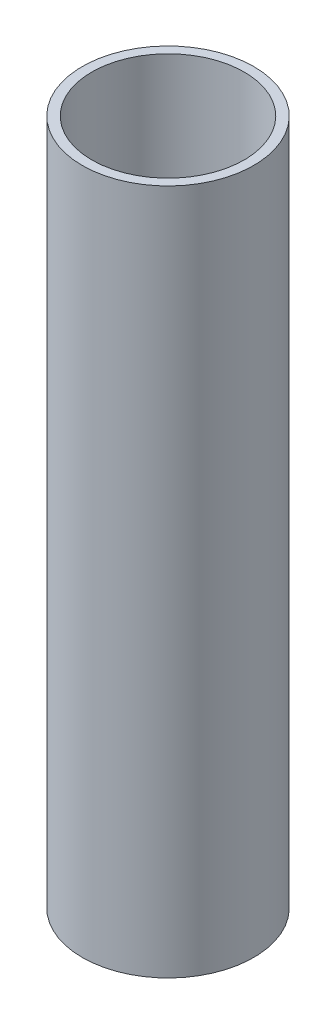
ISO-10303-21;
HEADER;
FILE_DESCRIPTION(('STEP AP214'),'2;1');
FILE_NAME('part.step','',(''),(''),'','','');
FILE_SCHEMA(('AUTOMOTIVE_DESIGN { 1 0 10303 214 1 1 1 1 }'));
ENDSEC;
DATA;
#1=APPLICATION_CONTEXT('core data for automotive mechanical design processes');
#2=APPLICATION_PROTOCOL_DEFINITION('international standard','automotive_design',2000,#1);
#3=PRODUCT_CONTEXT('',#1,'mechanical');
#4=PRODUCT('Part','Part','',(#3));
#5=PRODUCT_RELATED_PRODUCT_CATEGORY('part','',(#4));
#6=PRODUCT_DEFINITION_FORMATION('','',#4);
#7=PRODUCT_DEFINITION_CONTEXT('part definition',#1,'design');
#8=PRODUCT_DEFINITION('design','',#6,#7);
#9=PRODUCT_DEFINITION_SHAPE('','',#8);
#10=(LENGTH_UNIT() NAMED_UNIT(*) SI_UNIT(.MILLI.,.METRE.));
#11=(NAMED_UNIT(*) PLANE_ANGLE_UNIT() SI_UNIT($,.RADIAN.));
#12=(NAMED_UNIT(*) SI_UNIT($,.STERADIAN.) SOLID_ANGLE_UNIT());
#13=UNCERTAINTY_MEASURE_WITH_UNIT(LENGTH_MEASURE(1.E-05),#10,'distance_accuracy_value','');
#14=(GEOMETRIC_REPRESENTATION_CONTEXT(3) GLOBAL_UNCERTAINTY_ASSIGNED_CONTEXT((#13)) GLOBAL_UNIT_ASSIGNED_CONTEXT((#10,
#11,#12)) REPRESENTATION_CONTEXT('',''));
#15=CARTESIAN_POINT('',(0.,0.,0.));
#16=DIRECTION('',(0.,0.,1.));
#17=DIRECTION('',(1.,0.,0.));
#18=AXIS2_PLACEMENT_3D('',#15,#16,#17);
#19=CARTESIAN_POINT('',(0.,228.6,0.));
#20=DIRECTION('',(0.,1.,0.));
#21=DIRECTION('',(0.,0.,1.));
#22=AXIS2_PLACEMENT_3D('',#19,#20,#21);
#23=PLANE('',#22);
#24=CARTESIAN_POINT('',(0.,228.6,0.));
#25=DIRECTION('',(0.,1.,0.));
#26=DIRECTION('',(0.,0.,1.));
#27=AXIS2_PLACEMENT_3D('',#24,#25,#26);
#28=CIRCLE('',#27,57.15);
#29=CARTESIAN_POINT('',(0.,228.6,57.15));
#30=VERTEX_POINT('',#29);
#31=EDGE_CURVE('E10',#30,#30,#28,.T.);
#32=ORIENTED_EDGE('',*,*,#31,.T.);
#33=EDGE_LOOP('',(#32));
#34=FACE_BOUND('',#33,.T.);
#35=CARTESIAN_POINT('',(0.,228.6,0.));
#36=DIRECTION('',(0.,1.,0.));
#37=DIRECTION('',(0.,0.,1.));
#38=AXIS2_PLACEMENT_3D('',#35,#36,#37);
#39=CIRCLE('',#38,50.8);
#40=CARTESIAN_POINT('',(0.,228.6,50.8));
#41=VERTEX_POINT('',#40);
#42=EDGE_CURVE('E44',#41,#41,#39,.T.);
#43=ORIENTED_EDGE('',*,*,#42,.F.);
#44=EDGE_LOOP('',(#43));
#45=FACE_BOUND('',#44,.T.);
#46=ADVANCED_FACE('F33',(#34,#45),#23,.T.);
#47=CARTESIAN_POINT('',(0.,-228.6,0.));
#48=DIRECTION('',(0.,1.,0.));
#49=DIRECTION('',(0.,0.,1.));
#50=AXIS2_PLACEMENT_3D('',#47,#48,#49);
#51=PLANE('',#50);
#52=CARTESIAN_POINT('',(0.,-228.6,0.));
#53=DIRECTION('',(0.,1.,0.));
#54=DIRECTION('',(0.,0.,1.));
#55=AXIS2_PLACEMENT_3D('',#52,#53,#54);
#56=CIRCLE('',#55,57.15);
#57=CARTESIAN_POINT('',(0.,-228.6,57.15));
#58=VERTEX_POINT('',#57);
#59=EDGE_CURVE('E37',#58,#58,#56,.T.);
#60=ORIENTED_EDGE('',*,*,#59,.F.);
#61=EDGE_LOOP('',(#60));
#62=FACE_BOUND('',#61,.T.);
#63=CARTESIAN_POINT('',(0.,-228.6,0.));
#64=DIRECTION('',(0.,1.,0.));
#65=DIRECTION('',(0.,0.,1.));
#66=AXIS2_PLACEMENT_3D('',#63,#64,#65);
#67=CIRCLE('',#66,50.8);
#68=CARTESIAN_POINT('',(0.,-228.6,50.8));
#69=VERTEX_POINT('',#68);
#70=EDGE_CURVE('E46',#69,#69,#67,.T.);
#71=ORIENTED_EDGE('',*,*,#70,.T.);
#72=EDGE_LOOP('',(#71));
#73=FACE_BOUND('',#72,.T.);
#74=ADVANCED_FACE('F56',(#62,#73),#51,.F.);
#75=CARTESIAN_POINT('',(0.,228.6,0.));
#76=DIRECTION('',(0.,-1.,0.));
#77=DIRECTION('',(0.,0.,-1.));
#78=AXIS2_PLACEMENT_3D('',#75,#76,#77);
#79=CYLINDRICAL_SURFACE('',#78,57.15);
#80=ORIENTED_EDGE('',*,*,#31,.F.);
#81=EDGE_LOOP('',(#80));
#82=FACE_BOUND('',#81,.T.);
#83=ORIENTED_EDGE('',*,*,#59,.T.);
#84=EDGE_LOOP('',(#83));
#85=FACE_BOUND('',#84,.T.);
#86=ADVANCED_FACE('F35',(#82,#85),#79,.T.);
#87=CARTESIAN_POINT('',(0.,228.6,0.));
#88=DIRECTION('',(0.,-1.,0.));
#89=DIRECTION('',(0.,0.,-1.));
#90=AXIS2_PLACEMENT_3D('',#87,#88,#89);
#91=CYLINDRICAL_SURFACE('',#90,50.8);
#92=ORIENTED_EDGE('',*,*,#42,.T.);
#93=EDGE_LOOP('',(#92));
#94=FACE_BOUND('',#93,.T.);
#95=ORIENTED_EDGE('',*,*,#70,.F.);
#96=EDGE_LOOP('',(#95));
#97=FACE_BOUND('',#96,.T.);
#98=ADVANCED_FACE('F52',(#94,#97),#91,.F.);
#99=CLOSED_SHELL('',(#46,#74,#86,#98));
#100=MANIFOLD_SOLID_BREP('B2',#99);
#101=ADVANCED_BREP_SHAPE_REPRESENTATION('',(#18,#100),#14);
#102=SHAPE_DEFINITION_REPRESENTATION(#9,#101);
ENDSEC;
END-ISO-10303-21;
